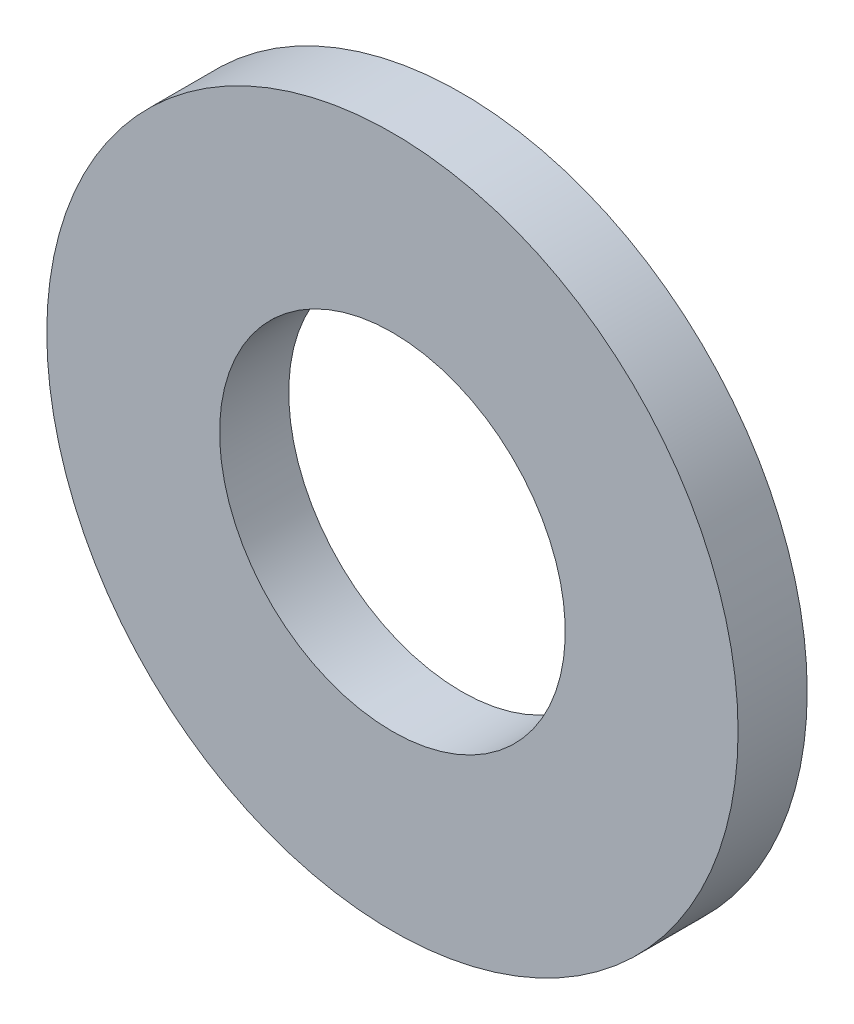
ISO-10303-21;
HEADER;
FILE_DESCRIPTION(('STEP AP214'),'2;1');
FILE_NAME('part.step','',(''),(''),'','','');
FILE_SCHEMA(('AUTOMOTIVE_DESIGN { 1 0 10303 214 1 1 1 1 }'));
ENDSEC;
DATA;
#1=APPLICATION_CONTEXT('core data for automotive mechanical design processes');
#2=APPLICATION_PROTOCOL_DEFINITION('international standard','automotive_design',2000,#1);
#3=PRODUCT_CONTEXT('',#1,'mechanical');
#4=PRODUCT('Part','Part','',(#3));
#5=PRODUCT_RELATED_PRODUCT_CATEGORY('part','',(#4));
#6=PRODUCT_DEFINITION_FORMATION('','',#4);
#7=PRODUCT_DEFINITION_CONTEXT('part definition',#1,'design');
#8=PRODUCT_DEFINITION('design','',#6,#7);
#9=PRODUCT_DEFINITION_SHAPE('','',#8);
#10=(LENGTH_UNIT() NAMED_UNIT(*) SI_UNIT(.MILLI.,.METRE.));
#11=(NAMED_UNIT(*) PLANE_ANGLE_UNIT() SI_UNIT($,.RADIAN.));
#12=(NAMED_UNIT(*) SI_UNIT($,.STERADIAN.) SOLID_ANGLE_UNIT());
#13=UNCERTAINTY_MEASURE_WITH_UNIT(LENGTH_MEASURE(1.E-05),#10,'distance_accuracy_value','');
#14=(GEOMETRIC_REPRESENTATION_CONTEXT(3) GLOBAL_UNCERTAINTY_ASSIGNED_CONTEXT((#13)) GLOBAL_UNIT_ASSIGNED_CONTEXT((#10,
#11,#12)) REPRESENTATION_CONTEXT('',''));
#15=CARTESIAN_POINT('',(0.,0.,0.));
#16=DIRECTION('',(0.,0.,1.));
#17=DIRECTION('',(1.,0.,0.));
#18=AXIS2_PLACEMENT_3D('',#15,#16,#17);
#19=CARTESIAN_POINT('',(0.,0.,1.6));
#20=DIRECTION('',(0.,0.,-1.));
#21=DIRECTION('',(-1.,0.,0.));
#22=AXIS2_PLACEMENT_3D('',#19,#20,#21);
#23=CYLINDRICAL_SURFACE('',#22,8.);
#24=CARTESIAN_POINT('',(0.,0.,1.6));
#25=DIRECTION('',(0.,0.,-1.));
#26=DIRECTION('',(1.,0.,0.));
#27=AXIS2_PLACEMENT_3D('',#24,#25,#26);
#28=CIRCLE('',#27,8.);
#29=CARTESIAN_POINT('',(8.,0.,1.6));
#30=VERTEX_POINT('',#29);
#31=EDGE_CURVE('E8',#30,#30,#28,.T.);
#32=ORIENTED_EDGE('',*,*,#31,.T.);
#33=EDGE_LOOP('',(#32));
#34=FACE_BOUND('',#33,.T.);
#35=CARTESIAN_POINT('',(0.,0.,0.));
#36=DIRECTION('',(0.,0.,-1.));
#37=DIRECTION('',(1.,0.,0.));
#38=AXIS2_PLACEMENT_3D('',#35,#36,#37);
#39=CIRCLE('',#38,8.);
#40=CARTESIAN_POINT('',(8.,0.,0.));
#41=VERTEX_POINT('',#40);
#42=EDGE_CURVE('E16',#41,#41,#39,.T.);
#43=ORIENTED_EDGE('',*,*,#42,.F.);
#44=EDGE_LOOP('',(#43));
#45=FACE_BOUND('',#44,.T.);
#46=ADVANCED_FACE('F13',(#34,#45),#23,.T.);
#47=CARTESIAN_POINT('',(0.,0.,1.6));
#48=DIRECTION('',(0.,0.,-1.));
#49=DIRECTION('',(-1.,0.,0.));
#50=AXIS2_PLACEMENT_3D('',#47,#48,#49);
#51=PLANE('',#50);
#52=ORIENTED_EDGE('',*,*,#31,.F.);
#53=EDGE_LOOP('',(#52));
#54=FACE_BOUND('',#53,.T.);
#55=CARTESIAN_POINT('',(0.,0.,1.6));
#56=DIRECTION('',(0.,0.,-1.));
#57=DIRECTION('',(0.,1.,0.));
#58=AXIS2_PLACEMENT_3D('',#55,#56,#57);
#59=CIRCLE('',#58,4.);
#60=CARTESIAN_POINT('',(0.,4.,1.6));
#61=VERTEX_POINT('',#60);
#62=EDGE_CURVE('E26',#61,#61,#59,.T.);
#63=ORIENTED_EDGE('',*,*,#62,.T.);
#64=EDGE_LOOP('',(#63));
#65=FACE_BOUND('',#64,.T.);
#66=ADVANCED_FACE('F38',(#54,#65),#51,.F.);
#67=CARTESIAN_POINT('',(0.,0.,0.));
#68=DIRECTION('',(0.,0.,-1.));
#69=DIRECTION('',(-1.,0.,0.));
#70=AXIS2_PLACEMENT_3D('',#67,#68,#69);
#71=PLANE('',#70);
#72=ORIENTED_EDGE('',*,*,#42,.T.);
#73=EDGE_LOOP('',(#72));
#74=FACE_BOUND('',#73,.T.);
#75=CARTESIAN_POINT('',(0.,0.,0.));
#76=DIRECTION('',(0.,0.,-1.));
#77=DIRECTION('',(0.,1.,0.));
#78=AXIS2_PLACEMENT_3D('',#75,#76,#77);
#79=CIRCLE('',#78,4.);
#80=CARTESIAN_POINT('',(0.,4.,0.));
#81=VERTEX_POINT('',#80);
#82=EDGE_CURVE('E24',#81,#81,#79,.T.);
#83=ORIENTED_EDGE('',*,*,#82,.F.);
#84=EDGE_LOOP('',(#83));
#85=FACE_BOUND('',#84,.T.);
#86=ADVANCED_FACE('F36',(#74,#85),#71,.T.);
#87=CARTESIAN_POINT('',(0.,0.,0.));
#88=DIRECTION('',(0.,0.,1.));
#89=DIRECTION('',(1.,0.,0.));
#90=AXIS2_PLACEMENT_3D('',#87,#88,#89);
#91=CYLINDRICAL_SURFACE('',#90,4.);
#92=ORIENTED_EDGE('',*,*,#82,.T.);
#93=EDGE_LOOP('',(#92));
#94=FACE_BOUND('',#93,.T.);
#95=ORIENTED_EDGE('',*,*,#62,.F.);
#96=EDGE_LOOP('',(#95));
#97=FACE_BOUND('',#96,.T.);
#98=ADVANCED_FACE('F33',(#94,#97),#91,.F.);
#99=CLOSED_SHELL('',(#46,#66,#86,#98));
#100=MANIFOLD_SOLID_BREP('B1',#99);
#101=ADVANCED_BREP_SHAPE_REPRESENTATION('',(#18,#100),#14);
#102=SHAPE_DEFINITION_REPRESENTATION(#9,#101);
ENDSEC;
END-ISO-10303-21;
